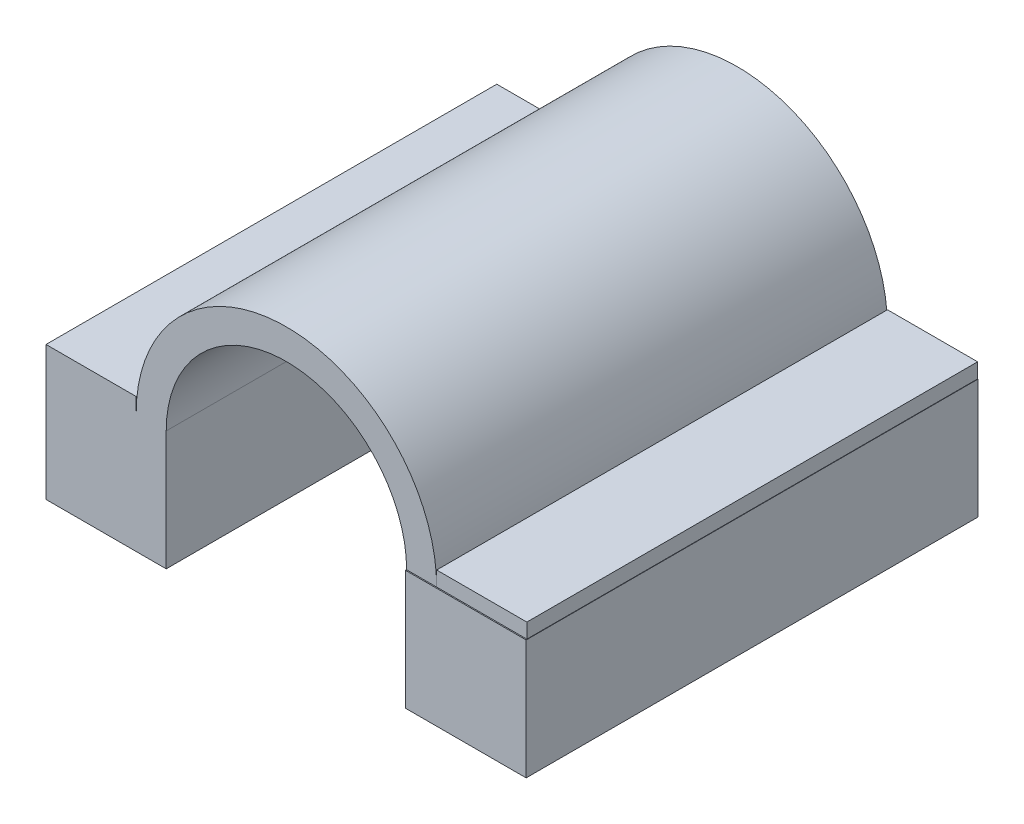
ISO-10303-21;
HEADER;
FILE_DESCRIPTION(('STEP AP214'),'2;1');
FILE_NAME('part.step','',(''),(''),'','','');
FILE_SCHEMA(('AUTOMOTIVE_DESIGN { 1 0 10303 214 1 1 1 1 }'));
ENDSEC;
DATA;
#1=APPLICATION_CONTEXT('core data for automotive mechanical design processes');
#2=APPLICATION_PROTOCOL_DEFINITION('international standard','automotive_design',2000,#1);
#3=PRODUCT_CONTEXT('',#1,'mechanical');
#4=PRODUCT('Part','Part','',(#3));
#5=PRODUCT_RELATED_PRODUCT_CATEGORY('part','',(#4));
#6=PRODUCT_DEFINITION_FORMATION('','',#4);
#7=PRODUCT_DEFINITION_CONTEXT('part definition',#1,'design');
#8=PRODUCT_DEFINITION('design','',#6,#7);
#9=PRODUCT_DEFINITION_SHAPE('','',#8);
#10=(LENGTH_UNIT() NAMED_UNIT(*) SI_UNIT(.MILLI.,.METRE.));
#11=(NAMED_UNIT(*) PLANE_ANGLE_UNIT() SI_UNIT($,.RADIAN.));
#12=(NAMED_UNIT(*) SI_UNIT($,.STERADIAN.) SOLID_ANGLE_UNIT());
#13=UNCERTAINTY_MEASURE_WITH_UNIT(LENGTH_MEASURE(1.E-05),#10,'distance_accuracy_value','');
#14=(GEOMETRIC_REPRESENTATION_CONTEXT(3) GLOBAL_UNCERTAINTY_ASSIGNED_CONTEXT((#13)) GLOBAL_UNIT_ASSIGNED_CONTEXT((#10,
#11,#12)) REPRESENTATION_CONTEXT('',''));
#15=CARTESIAN_POINT('',(0.,0.,0.));
#16=DIRECTION('',(0.,0.,1.));
#17=DIRECTION('',(1.,0.,0.));
#18=AXIS2_PLACEMENT_3D('',#15,#16,#17);
#19=CARTESIAN_POINT('',(-16.,0.,0.));
#20=DIRECTION('',(0.,0.,1.));
#21=DIRECTION('',(1.,0.,0.));
#22=AXIS2_PLACEMENT_3D('',#19,#20,#21);
#23=PLANE('',#22);
#24=DIRECTION('',(0.,-1.,0.));
#25=VECTOR('',#24,1.);
#26=CARTESIAN_POINT('',(-10.,0.,0.));
#27=LINE('',#26,#25);
#28=CARTESIAN_POINT('',(-10.,0.98482236855264,0.));
#29=VERTEX_POINT('',#28);
#30=CARTESIAN_POINT('',(-10.,0.,0.));
#31=VERTEX_POINT('',#30);
#32=EDGE_CURVE('E117',#29,#31,#27,.T.);
#33=ORIENTED_EDGE('',*,*,#32,.T.);
#34=CARTESIAN_POINT('',(0.,0.,0.));
#35=DIRECTION('',(0.,0.,1.));
#36=DIRECTION('',(1.,0.,0.));
#37=AXIS2_PLACEMENT_3D('',#34,#35,#36);
#38=CIRCLE('',#37,10.);
#39=CARTESIAN_POINT('',(10.,0.,0.));
#40=VERTEX_POINT('',#39);
#41=EDGE_CURVE('E156',#40,#31,#38,.T.);
#42=ORIENTED_EDGE('',*,*,#41,.F.);
#43=DIRECTION('',(0.,1.,0.));
#44=VECTOR('',#43,1.);
#45=CARTESIAN_POINT('',(10.,0.,0.));
#46=LINE('',#45,#44);
#47=CARTESIAN_POINT('',(10.,0.98482236855264,0.));
#48=VERTEX_POINT('',#47);
#49=EDGE_CURVE('E374',#40,#48,#46,.T.);
#50=ORIENTED_EDGE('',*,*,#49,.T.);
#51=DIRECTION('',(-1.,0.,0.));
#52=VECTOR('',#51,1.);
#53=CARTESIAN_POINT('',(16.,0.98482236855264,0.));
#54=LINE('',#53,#52);
#55=CARTESIAN_POINT('',(16.,0.98482236855264,0.));
#56=VERTEX_POINT('',#55);
#57=EDGE_CURVE('E399',#56,#48,#54,.T.);
#58=ORIENTED_EDGE('',*,*,#57,.F.);
#59=DIRECTION('',(0.,1.,0.));
#60=VECTOR('',#59,1.);
#61=CARTESIAN_POINT('',(16.,0.,0.));
#62=LINE('',#61,#60);
#63=CARTESIAN_POINT('',(16.,0.,0.));
#64=VERTEX_POINT('',#63);
#65=EDGE_CURVE('E393',#64,#56,#62,.T.);
#66=ORIENTED_EDGE('',*,*,#65,.F.);
#67=DIRECTION('',(-1.,0.,0.));
#68=VECTOR('',#67,1.);
#69=CARTESIAN_POINT('',(16.024735177831,0.,0.));
#70=LINE('',#69,#68);
#71=CARTESIAN_POINT('',(16.024735177831,0.,0.));
#72=VERTEX_POINT('',#71);
#73=EDGE_CURVE('E414',#72,#64,#70,.T.);
#74=ORIENTED_EDGE('',*,*,#73,.F.);
#75=DIRECTION('',(0.,1.,0.));
#76=VECTOR('',#75,1.);
#77=CARTESIAN_POINT('',(16.024735177831,-7.95,0.));
#78=LINE('',#77,#76);
#79=CARTESIAN_POINT('',(16.024735177831,-7.95,0.));
#80=VERTEX_POINT('',#79);
#81=EDGE_CURVE('E187',#80,#72,#78,.T.);
#82=ORIENTED_EDGE('',*,*,#81,.F.);
#83=DIRECTION('',(-1.,0.,0.));
#84=VECTOR('',#83,1.);
#85=CARTESIAN_POINT('',(16.024735177831,-7.95,0.));
#86=LINE('',#85,#84);
#87=CARTESIAN_POINT('',(8.,-7.95,0.));
#88=VERTEX_POINT('',#87);
#89=EDGE_CURVE('E186',#80,#88,#86,.T.);
#90=ORIENTED_EDGE('',*,*,#89,.T.);
#91=DIRECTION('',(0.,1.,0.));
#92=VECTOR('',#91,1.);
#93=CARTESIAN_POINT('',(8.,-7.95,0.));
#94=LINE('',#93,#92);
#95=CARTESIAN_POINT('',(8.,0.,0.));
#96=VERTEX_POINT('',#95);
#97=EDGE_CURVE('E178',#88,#96,#94,.T.);
#98=ORIENTED_EDGE('',*,*,#97,.T.);
#99=CARTESIAN_POINT('',(0.,0.,0.));
#100=DIRECTION('',(0.,0.,1.));
#101=DIRECTION('',(1.,0.,0.));
#102=AXIS2_PLACEMENT_3D('',#99,#100,#101);
#103=CIRCLE('',#102,8.);
#104=CARTESIAN_POINT('',(-8.,0.,0.));
#105=VERTEX_POINT('',#104);
#106=EDGE_CURVE('E80',#96,#105,#103,.T.);
#107=ORIENTED_EDGE('',*,*,#106,.T.);
#108=DIRECTION('',(0.,1.,0.));
#109=VECTOR('',#108,1.);
#110=CARTESIAN_POINT('',(-8.,-7.95,0.));
#111=LINE('',#110,#109);
#112=CARTESIAN_POINT('',(-8.,-7.95,0.));
#113=VERTEX_POINT('',#112);
#114=EDGE_CURVE('E114',#113,#105,#111,.T.);
#115=ORIENTED_EDGE('',*,*,#114,.F.);
#116=DIRECTION('',(1.,0.,0.));
#117=VECTOR('',#116,1.);
#118=CARTESIAN_POINT('',(-16.,-7.95,0.));
#119=LINE('',#118,#117);
#120=CARTESIAN_POINT('',(-16.,-7.95,0.));
#121=VERTEX_POINT('',#120);
#122=EDGE_CURVE('E104',#121,#113,#119,.T.);
#123=ORIENTED_EDGE('',*,*,#122,.F.);
#124=DIRECTION('',(0.,-1.,0.));
#125=VECTOR('',#124,1.);
#126=CARTESIAN_POINT('',(-16.,0.,0.));
#127=LINE('',#126,#125);
#128=CARTESIAN_POINT('',(-16.,0.98482236855264,0.));
#129=VERTEX_POINT('',#128);
#130=EDGE_CURVE('E131',#129,#121,#127,.T.);
#131=ORIENTED_EDGE('',*,*,#130,.F.);
#132=DIRECTION('',(1.,0.,0.));
#133=VECTOR('',#132,1.);
#134=CARTESIAN_POINT('',(-16.,0.98482236855264,0.));
#135=LINE('',#134,#133);
#136=EDGE_CURVE('E41',#129,#29,#135,.T.);
#137=ORIENTED_EDGE('',*,*,#136,.T.);
#138=EDGE_LOOP('',(#33,#42,#50,#58,#66,#74,#82,#90,#98,#107,#115,#123,#131,#137));
#139=FACE_BOUND('',#138,.T.);
#140=ADVANCED_FACE('F33',(#139),#23,.F.);
#141=CARTESIAN_POINT('',(-16.,0.,30.));
#142=DIRECTION('',(0.,0.,-1.));
#143=DIRECTION('',(-1.,0.,0.));
#144=AXIS2_PLACEMENT_3D('',#141,#142,#143);
#145=PLANE('',#144);
#146=DIRECTION('',(0.,1.,0.));
#147=VECTOR('',#146,1.);
#148=CARTESIAN_POINT('',(-10.,0.,30.));
#149=LINE('',#148,#147);
#150=CARTESIAN_POINT('',(-10.,0.,30.));
#151=VERTEX_POINT('',#150);
#152=CARTESIAN_POINT('',(-10.,0.98482236855264,30.));
#153=VERTEX_POINT('',#152);
#154=EDGE_CURVE('E60',#151,#153,#149,.T.);
#155=ORIENTED_EDGE('',*,*,#154,.T.);
#156=DIRECTION('',(1.,0.,0.));
#157=VECTOR('',#156,1.);
#158=CARTESIAN_POINT('',(-16.,0.98482236855264,30.));
#159=LINE('',#158,#157);
#160=CARTESIAN_POINT('',(-16.,0.98482236855264,30.));
#161=VERTEX_POINT('',#160);
#162=EDGE_CURVE('E11',#161,#153,#159,.T.);
#163=ORIENTED_EDGE('',*,*,#162,.F.);
#164=DIRECTION('',(0.,1.,0.));
#165=VECTOR('',#164,1.);
#166=CARTESIAN_POINT('',(-16.,0.,30.));
#167=LINE('',#166,#165);
#168=CARTESIAN_POINT('',(-16.,-7.95,30.));
#169=VERTEX_POINT('',#168);
#170=EDGE_CURVE('E66',#169,#161,#167,.T.);
#171=ORIENTED_EDGE('',*,*,#170,.F.);
#172=DIRECTION('',(-1.,0.,0.));
#173=VECTOR('',#172,1.);
#174=CARTESIAN_POINT('',(-16.,-7.95,30.));
#175=LINE('',#174,#173);
#176=CARTESIAN_POINT('',(-8.,-7.95,30.));
#177=VERTEX_POINT('',#176);
#178=EDGE_CURVE('E122',#177,#169,#175,.T.);
#179=ORIENTED_EDGE('',*,*,#178,.F.);
#180=DIRECTION('',(0.,1.,0.));
#181=VECTOR('',#180,1.);
#182=CARTESIAN_POINT('',(-8.,-7.95,30.));
#183=LINE('',#182,#181);
#184=CARTESIAN_POINT('',(-8.,0.,30.));
#185=VERTEX_POINT('',#184);
#186=EDGE_CURVE('E118',#177,#185,#183,.T.);
#187=ORIENTED_EDGE('',*,*,#186,.T.);
#188=CARTESIAN_POINT('',(0.,0.,30.));
#189=DIRECTION('',(0.,0.,1.));
#190=DIRECTION('',(1.,0.,0.));
#191=AXIS2_PLACEMENT_3D('',#188,#189,#190);
#192=CIRCLE('',#191,8.);
#193=CARTESIAN_POINT('',(8.,0.,30.));
#194=VERTEX_POINT('',#193);
#195=EDGE_CURVE('E89',#194,#185,#192,.T.);
#196=ORIENTED_EDGE('',*,*,#195,.F.);
#197=DIRECTION('',(-1.,0.,0.));
#198=VECTOR('',#197,1.);
#199=CARTESIAN_POINT('',(10.,0.,30.));
#200=LINE('',#199,#198);
#201=CARTESIAN_POINT('',(10.,0.,30.));
#202=VERTEX_POINT('',#201);
#203=EDGE_CURVE('E168',#202,#194,#200,.T.);
#204=ORIENTED_EDGE('',*,*,#203,.F.);
#205=CARTESIAN_POINT('',(0.,0.,30.));
#206=DIRECTION('',(0.,0.,1.));
#207=DIRECTION('',(1.,0.,0.));
#208=AXIS2_PLACEMENT_3D('',#205,#206,#207);
#209=CIRCLE('',#208,10.);
#210=EDGE_CURVE('E154',#202,#151,#209,.T.);
#211=ORIENTED_EDGE('',*,*,#210,.T.);
#212=EDGE_LOOP('',(#155,#163,#171,#179,#187,#196,#204,#211));
#213=FACE_BOUND('',#212,.T.);
#214=ADVANCED_FACE('F190',(#213),#145,.F.);
#215=CARTESIAN_POINT('',(-16.,0.98482236855264,0.));
#216=DIRECTION('',(0.,-1.,0.));
#217=DIRECTION('',(0.,0.,-1.));
#218=AXIS2_PLACEMENT_3D('',#215,#216,#217);
#219=PLANE('',#218);
#220=DIRECTION('',(0.,0.,-1.));
#221=VECTOR('',#220,1.);
#222=CARTESIAN_POINT('',(-10.,0.98482236855264,0.));
#223=LINE('',#222,#221);
#224=EDGE_CURVE('E133',#153,#29,#223,.T.);
#225=ORIENTED_EDGE('',*,*,#224,.T.);
#226=ORIENTED_EDGE('',*,*,#136,.F.);
#227=DIRECTION('',(0.,0.,-1.));
#228=VECTOR('',#227,1.);
#229=CARTESIAN_POINT('',(-16.,0.98482236855264,0.));
#230=LINE('',#229,#228);
#231=EDGE_CURVE('E49',#161,#129,#230,.T.);
#232=ORIENTED_EDGE('',*,*,#231,.F.);
#233=ORIENTED_EDGE('',*,*,#162,.T.);
#234=EDGE_LOOP('',(#225,#226,#232,#233));
#235=FACE_BOUND('',#234,.T.);
#236=ADVANCED_FACE('F192',(#235),#219,.F.);
#237=CARTESIAN_POINT('',(-16.,0.,0.));
#238=DIRECTION('',(1.,0.,0.));
#239=DIRECTION('',(0.,0.,-1.));
#240=AXIS2_PLACEMENT_3D('',#237,#238,#239);
#241=PLANE('',#240);
#242=ORIENTED_EDGE('',*,*,#130,.T.);
#243=DIRECTION('',(0.,0.,-1.));
#244=VECTOR('',#243,1.);
#245=CARTESIAN_POINT('',(-16.,-7.95,0.));
#246=LINE('',#245,#244);
#247=EDGE_CURVE('E110',#169,#121,#246,.T.);
#248=ORIENTED_EDGE('',*,*,#247,.F.);
#249=ORIENTED_EDGE('',*,*,#170,.T.);
#250=ORIENTED_EDGE('',*,*,#231,.T.);
#251=EDGE_LOOP('',(#242,#248,#249,#250));
#252=FACE_BOUND('',#251,.T.);
#253=ADVANCED_FACE('F191',(#252),#241,.F.);
#254=CARTESIAN_POINT('',(-10.,0.,0.));
#255=DIRECTION('',(1.,0.,0.));
#256=DIRECTION('',(0.,0.,-1.));
#257=AXIS2_PLACEMENT_3D('',#254,#255,#256);
#258=PLANE('',#257);
#259=ORIENTED_EDGE('',*,*,#32,.F.);
#260=ORIENTED_EDGE('',*,*,#224,.F.);
#261=ORIENTED_EDGE('',*,*,#154,.F.);
#262=DIRECTION('',(0.,0.,1.));
#263=VECTOR('',#262,1.);
#264=CARTESIAN_POINT('',(-10.,0.,0.));
#265=LINE('',#264,#263);
#266=EDGE_CURVE('E137',#31,#151,#265,.T.);
#267=ORIENTED_EDGE('',*,*,#266,.F.);
#268=EDGE_LOOP('',(#259,#260,#261,#267));
#269=FACE_BOUND('',#268,.T.);
#270=ADVANCED_FACE('F148',(#269),#258,.T.);
#271=CARTESIAN_POINT('',(-8.,-7.95,0.));
#272=DIRECTION('',(-1.,0.,0.));
#273=DIRECTION('',(0.,0.,1.));
#274=AXIS2_PLACEMENT_3D('',#271,#272,#273);
#275=PLANE('',#274);
#276=DIRECTION('',(0.,0.,1.));
#277=VECTOR('',#276,1.);
#278=CARTESIAN_POINT('',(-8.,0.,0.));
#279=LINE('',#278,#277);
#280=EDGE_CURVE('E127',#105,#185,#279,.T.);
#281=ORIENTED_EDGE('',*,*,#280,.T.);
#282=ORIENTED_EDGE('',*,*,#186,.F.);
#283=DIRECTION('',(0.,0.,1.));
#284=VECTOR('',#283,1.);
#285=CARTESIAN_POINT('',(-8.,-7.95,0.));
#286=LINE('',#285,#284);
#287=EDGE_CURVE('E107',#113,#177,#286,.T.);
#288=ORIENTED_EDGE('',*,*,#287,.F.);
#289=ORIENTED_EDGE('',*,*,#114,.T.);
#290=EDGE_LOOP('',(#281,#282,#288,#289));
#291=FACE_BOUND('',#290,.T.);
#292=ADVANCED_FACE('F120',(#291),#275,.F.);
#293=CARTESIAN_POINT('',(0.,-7.95,0.));
#294=DIRECTION('',(0.,1.,0.));
#295=DIRECTION('',(0.,0.,1.));
#296=AXIS2_PLACEMENT_3D('',#293,#294,#295);
#297=PLANE('',#296);
#298=ORIENTED_EDGE('',*,*,#247,.T.);
#299=ORIENTED_EDGE('',*,*,#122,.T.);
#300=ORIENTED_EDGE('',*,*,#287,.T.);
#301=ORIENTED_EDGE('',*,*,#178,.T.);
#302=EDGE_LOOP('',(#298,#299,#300,#301));
#303=FACE_BOUND('',#302,.T.);
#304=ADVANCED_FACE('F105',(#303),#297,.F.);
#305=CARTESIAN_POINT('',(0.,0.,0.));
#306=DIRECTION('',(0.,1.,0.));
#307=DIRECTION('',(0.,0.,1.));
#308=AXIS2_PLACEMENT_3D('',#305,#306,#307);
#309=PLANE('',#308);
#310=DIRECTION('',(0.,0.,-1.));
#311=VECTOR('',#310,1.);
#312=CARTESIAN_POINT('',(16.,0.,0.));
#313=LINE('',#312,#311);
#314=CARTESIAN_POINT('',(16.,0.,30.));
#315=VERTEX_POINT('',#314);
#316=EDGE_CURVE('E388',#315,#64,#313,.T.);
#317=ORIENTED_EDGE('',*,*,#316,.F.);
#318=DIRECTION('',(-1.,0.,0.));
#319=VECTOR('',#318,1.);
#320=CARTESIAN_POINT('',(16.,0.,30.));
#321=LINE('',#320,#319);
#322=EDGE_CURVE('E394',#315,#202,#321,.T.);
#323=ORIENTED_EDGE('',*,*,#322,.T.);
#324=ORIENTED_EDGE('',*,*,#203,.T.);
#325=DIRECTION('',(0.,0.,1.));
#326=VECTOR('',#325,1.);
#327=CARTESIAN_POINT('',(8.,0.,30.0710652233473));
#328=LINE('',#327,#326);
#329=CARTESIAN_POINT('',(8.,0.,30.0710652233473));
#330=VERTEX_POINT('',#329);
#331=EDGE_CURVE('E182',#194,#330,#328,.T.);
#332=ORIENTED_EDGE('',*,*,#331,.T.);
#333=DIRECTION('',(1.,0.,0.));
#334=VECTOR('',#333,1.);
#335=CARTESIAN_POINT('',(16.024735177831,0.,30.0710652233473));
#336=LINE('',#335,#334);
#337=CARTESIAN_POINT('',(16.024735177831,0.,30.0710652233473));
#338=VERTEX_POINT('',#337);
#339=EDGE_CURVE('E405',#330,#338,#336,.T.);
#340=ORIENTED_EDGE('',*,*,#339,.T.);
#341=DIRECTION('',(0.,0.,-1.));
#342=VECTOR('',#341,1.);
#343=CARTESIAN_POINT('',(16.024735177831,0.,30.0710652233473));
#344=LINE('',#343,#342);
#345=EDGE_CURVE('E401',#338,#72,#344,.T.);
#346=ORIENTED_EDGE('',*,*,#345,.T.);
#347=ORIENTED_EDGE('',*,*,#73,.T.);
#348=EDGE_LOOP('',(#317,#323,#324,#332,#340,#346,#347));
#349=FACE_BOUND('',#348,.T.);
#350=ADVANCED_FACE('F241',(#349),#309,.T.);
#351=CARTESIAN_POINT('',(0.,0.,30.));
#352=DIRECTION('',(0.,0.,-1.));
#353=DIRECTION('',(-1.,0.,0.));
#354=AXIS2_PLACEMENT_3D('',#351,#352,#353);
#355=CYLINDRICAL_SURFACE('',#354,10.);
#356=ORIENTED_EDGE('',*,*,#41,.T.);
#357=ORIENTED_EDGE('',*,*,#266,.T.);
#358=ORIENTED_EDGE('',*,*,#210,.F.);
#359=DIRECTION('',(0.,0.,-1.));
#360=VECTOR('',#359,1.);
#361=CARTESIAN_POINT('',(10.,0.,30.));
#362=LINE('',#361,#360);
#363=EDGE_CURVE('E159',#202,#40,#362,.T.);
#364=ORIENTED_EDGE('',*,*,#363,.T.);
#365=EDGE_LOOP('',(#356,#357,#358,#364));
#366=FACE_BOUND('',#365,.T.);
#367=ADVANCED_FACE('F151',(#366),#355,.T.);
#368=CARTESIAN_POINT('',(0.,0.,30.));
#369=DIRECTION('',(0.,0.,-1.));
#370=DIRECTION('',(-1.,0.,0.));
#371=AXIS2_PLACEMENT_3D('',#368,#369,#370);
#372=CYLINDRICAL_SURFACE('',#371,8.);
#373=ORIENTED_EDGE('',*,*,#106,.F.);
#374=DIRECTION('',(0.,0.,-1.));
#375=VECTOR('',#374,1.);
#376=CARTESIAN_POINT('',(8.,0.,30.));
#377=LINE('',#376,#375);
#378=EDGE_CURVE('E129',#194,#96,#377,.T.);
#379=ORIENTED_EDGE('',*,*,#378,.F.);
#380=ORIENTED_EDGE('',*,*,#195,.T.);
#381=ORIENTED_EDGE('',*,*,#280,.F.);
#382=EDGE_LOOP('',(#373,#379,#380,#381));
#383=FACE_BOUND('',#382,.T.);
#384=ADVANCED_FACE('F189',(#383),#372,.F.);
#385=CARTESIAN_POINT('',(16.024735177831,-7.95,30.0710652233473));
#386=DIRECTION('',(1.,0.,0.));
#387=DIRECTION('',(0.,0.,-1.));
#388=AXIS2_PLACEMENT_3D('',#385,#386,#387);
#389=PLANE('',#388);
#390=ORIENTED_EDGE('',*,*,#345,.F.);
#391=DIRECTION('',(0.,1.,0.));
#392=VECTOR('',#391,1.);
#393=CARTESIAN_POINT('',(16.024735177831,-7.95,30.0710652233473));
#394=LINE('',#393,#392);
#395=CARTESIAN_POINT('',(16.024735177831,-7.95,30.0710652233473));
#396=VERTEX_POINT('',#395);
#397=EDGE_CURVE('E161',#396,#338,#394,.T.);
#398=ORIENTED_EDGE('',*,*,#397,.F.);
#399=DIRECTION('',(0.,0.,-1.));
#400=VECTOR('',#399,1.);
#401=CARTESIAN_POINT('',(16.024735177831,-7.95,30.0710652233473));
#402=LINE('',#401,#400);
#403=EDGE_CURVE('E402',#396,#80,#402,.T.);
#404=ORIENTED_EDGE('',*,*,#403,.T.);
#405=ORIENTED_EDGE('',*,*,#81,.T.);
#406=EDGE_LOOP('',(#390,#398,#404,#405));
#407=FACE_BOUND('',#406,.T.);
#408=ADVANCED_FACE('F266',(#407),#389,.T.);
#409=CARTESIAN_POINT('',(16.024735177831,-7.95,30.0710652233473));
#410=DIRECTION('',(0.,0.,1.));
#411=DIRECTION('',(1.,0.,0.));
#412=AXIS2_PLACEMENT_3D('',#409,#410,#411);
#413=PLANE('',#412);
#414=ORIENTED_EDGE('',*,*,#339,.F.);
#415=DIRECTION('',(0.,1.,0.));
#416=VECTOR('',#415,1.);
#417=CARTESIAN_POINT('',(8.,-7.95,30.0710652233473));
#418=LINE('',#417,#416);
#419=CARTESIAN_POINT('',(8.,-7.95,30.0710652233473));
#420=VERTEX_POINT('',#419);
#421=EDGE_CURVE('E165',#420,#330,#418,.T.);
#422=ORIENTED_EDGE('',*,*,#421,.F.);
#423=DIRECTION('',(1.,0.,0.));
#424=VECTOR('',#423,1.);
#425=CARTESIAN_POINT('',(16.024735177831,-7.95,30.0710652233473));
#426=LINE('',#425,#424);
#427=EDGE_CURVE('E409',#420,#396,#426,.T.);
#428=ORIENTED_EDGE('',*,*,#427,.T.);
#429=ORIENTED_EDGE('',*,*,#397,.T.);
#430=EDGE_LOOP('',(#414,#422,#428,#429));
#431=FACE_BOUND('',#430,.T.);
#432=ADVANCED_FACE('F275',(#431),#413,.T.);
#433=CARTESIAN_POINT('',(8.,-7.95,30.0710652233473));
#434=DIRECTION('',(-1.,0.,0.));
#435=DIRECTION('',(0.,0.,1.));
#436=AXIS2_PLACEMENT_3D('',#433,#434,#435);
#437=PLANE('',#436);
#438=ORIENTED_EDGE('',*,*,#378,.T.);
#439=ORIENTED_EDGE('',*,*,#97,.F.);
#440=DIRECTION('',(0.,0.,1.));
#441=VECTOR('',#440,1.);
#442=CARTESIAN_POINT('',(8.,-7.95,30.0710652233473));
#443=LINE('',#442,#441);
#444=EDGE_CURVE('E407',#88,#420,#443,.T.);
#445=ORIENTED_EDGE('',*,*,#444,.T.);
#446=ORIENTED_EDGE('',*,*,#421,.T.);
#447=ORIENTED_EDGE('',*,*,#331,.F.);
#448=EDGE_LOOP('',(#438,#439,#445,#446,#447));
#449=FACE_BOUND('',#448,.T.);
#450=ADVANCED_FACE('F175',(#449),#437,.T.);
#451=CARTESIAN_POINT('',(0.,-7.95,0.));
#452=DIRECTION('',(0.,1.,0.));
#453=DIRECTION('',(0.,0.,1.));
#454=AXIS2_PLACEMENT_3D('',#451,#452,#453);
#455=PLANE('',#454);
#456=ORIENTED_EDGE('',*,*,#403,.F.);
#457=ORIENTED_EDGE('',*,*,#427,.F.);
#458=ORIENTED_EDGE('',*,*,#444,.F.);
#459=ORIENTED_EDGE('',*,*,#89,.F.);
#460=EDGE_LOOP('',(#456,#457,#458,#459));
#461=FACE_BOUND('',#460,.T.);
#462=ADVANCED_FACE('F294',(#461),#455,.F.);
#463=CARTESIAN_POINT('',(16.,0.98482236855264,0.));
#464=DIRECTION('',(0.,-1.,0.));
#465=DIRECTION('',(0.,0.,-1.));
#466=AXIS2_PLACEMENT_3D('',#463,#464,#465);
#467=PLANE('',#466);
#468=DIRECTION('',(0.,0.,1.));
#469=VECTOR('',#468,1.);
#470=CARTESIAN_POINT('',(10.,0.98482236855264,0.));
#471=LINE('',#470,#469);
#472=CARTESIAN_POINT('',(10.,0.98482236855264,30.));
#473=VERTEX_POINT('',#472);
#474=EDGE_CURVE('E379',#48,#473,#471,.T.);
#475=ORIENTED_EDGE('',*,*,#474,.T.);
#476=DIRECTION('',(-1.,0.,0.));
#477=VECTOR('',#476,1.);
#478=CARTESIAN_POINT('',(16.,0.98482236855264,30.));
#479=LINE('',#478,#477);
#480=CARTESIAN_POINT('',(16.,0.98482236855264,30.));
#481=VERTEX_POINT('',#480);
#482=EDGE_CURVE('E396',#481,#473,#479,.T.);
#483=ORIENTED_EDGE('',*,*,#482,.F.);
#484=DIRECTION('',(0.,0.,1.));
#485=VECTOR('',#484,1.);
#486=CARTESIAN_POINT('',(16.,0.98482236855264,0.));
#487=LINE('',#486,#485);
#488=EDGE_CURVE('E460',#56,#481,#487,.T.);
#489=ORIENTED_EDGE('',*,*,#488,.F.);
#490=ORIENTED_EDGE('',*,*,#57,.T.);
#491=EDGE_LOOP('',(#475,#483,#489,#490));
#492=FACE_BOUND('',#491,.T.);
#493=ADVANCED_FACE('F303',(#492),#467,.F.);
#494=CARTESIAN_POINT('',(16.,0.,30.));
#495=DIRECTION('',(0.,0.,-1.));
#496=DIRECTION('',(-1.,0.,0.));
#497=AXIS2_PLACEMENT_3D('',#494,#495,#496);
#498=PLANE('',#497);
#499=DIRECTION('',(0.,-1.,0.));
#500=VECTOR('',#499,1.);
#501=CARTESIAN_POINT('',(10.,0.,30.));
#502=LINE('',#501,#500);
#503=EDGE_CURVE('E385',#473,#202,#502,.T.);
#504=ORIENTED_EDGE('',*,*,#503,.T.);
#505=ORIENTED_EDGE('',*,*,#322,.F.);
#506=DIRECTION('',(0.,-1.,0.));
#507=VECTOR('',#506,1.);
#508=CARTESIAN_POINT('',(16.,0.,30.));
#509=LINE('',#508,#507);
#510=EDGE_CURVE('E462',#481,#315,#509,.T.);
#511=ORIENTED_EDGE('',*,*,#510,.F.);
#512=ORIENTED_EDGE('',*,*,#482,.T.);
#513=EDGE_LOOP('',(#504,#505,#511,#512));
#514=FACE_BOUND('',#513,.T.);
#515=ADVANCED_FACE('F313',(#514),#498,.F.);
#516=CARTESIAN_POINT('',(16.,0.,0.));
#517=DIRECTION('',(1.,0.,0.));
#518=DIRECTION('',(0.,0.,-1.));
#519=AXIS2_PLACEMENT_3D('',#516,#517,#518);
#520=PLANE('',#519);
#521=ORIENTED_EDGE('',*,*,#65,.T.);
#522=ORIENTED_EDGE('',*,*,#488,.T.);
#523=ORIENTED_EDGE('',*,*,#510,.T.);
#524=ORIENTED_EDGE('',*,*,#316,.T.);
#525=EDGE_LOOP('',(#521,#522,#523,#524));
#526=FACE_BOUND('',#525,.T.);
#527=ADVANCED_FACE('F323',(#526),#520,.T.);
#528=CARTESIAN_POINT('',(10.,0.,0.));
#529=DIRECTION('',(1.,0.,0.));
#530=DIRECTION('',(0.,0.,-1.));
#531=AXIS2_PLACEMENT_3D('',#528,#529,#530);
#532=PLANE('',#531);
#533=ORIENTED_EDGE('',*,*,#49,.F.);
#534=ORIENTED_EDGE('',*,*,#363,.F.);
#535=ORIENTED_EDGE('',*,*,#503,.F.);
#536=ORIENTED_EDGE('',*,*,#474,.F.);
#537=EDGE_LOOP('',(#533,#534,#535,#536));
#538=FACE_BOUND('',#537,.T.);
#539=ADVANCED_FACE('F333',(#538),#532,.F.);
#540=CLOSED_SHELL('',(#140,#214,#236,#253,#270,#292,#304,#350,#367,#384,#408,#432,#450,#462,
#493,#515,#527,#539));
#541=MANIFOLD_SOLID_BREP('B2',#540);
#542=ADVANCED_BREP_SHAPE_REPRESENTATION('',(#18,#541),#14);
#543=SHAPE_DEFINITION_REPRESENTATION(#9,#542);
ENDSEC;
END-ISO-10303-21;
